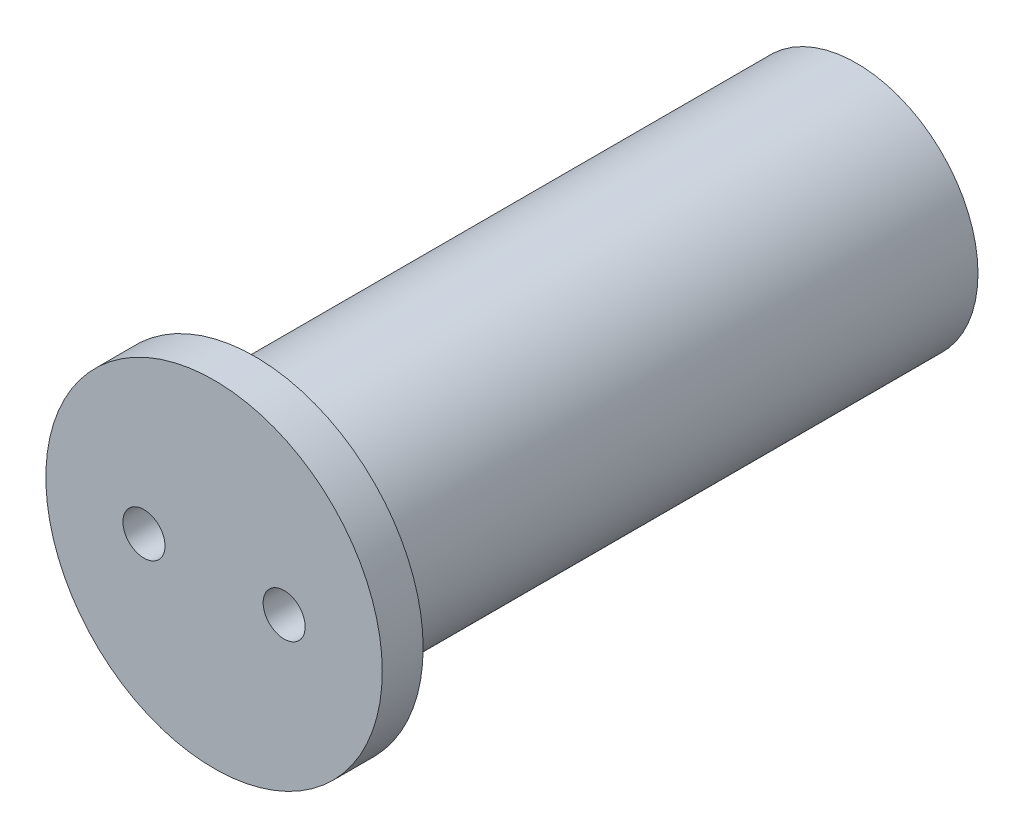
ISO-10303-21;
HEADER;
FILE_DESCRIPTION(('STEP AP214'),'2;1');
FILE_NAME('part.step','',(''),(''),'','','');
FILE_SCHEMA(('AUTOMOTIVE_DESIGN { 1 0 10303 214 1 1 1 1 }'));
ENDSEC;
DATA;
#1=APPLICATION_CONTEXT('core data for automotive mechanical design processes');
#2=APPLICATION_PROTOCOL_DEFINITION('international standard','automotive_design',2000,#1);
#3=PRODUCT_CONTEXT('',#1,'mechanical');
#4=PRODUCT('Part','Part','',(#3));
#5=PRODUCT_RELATED_PRODUCT_CATEGORY('part','',(#4));
#6=PRODUCT_DEFINITION_FORMATION('','',#4);
#7=PRODUCT_DEFINITION_CONTEXT('part definition',#1,'design');
#8=PRODUCT_DEFINITION('design','',#6,#7);
#9=PRODUCT_DEFINITION_SHAPE('','',#8);
#10=(LENGTH_UNIT() NAMED_UNIT(*) SI_UNIT(.MILLI.,.METRE.));
#11=(NAMED_UNIT(*) PLANE_ANGLE_UNIT() SI_UNIT($,.RADIAN.));
#12=(NAMED_UNIT(*) SI_UNIT($,.STERADIAN.) SOLID_ANGLE_UNIT());
#13=UNCERTAINTY_MEASURE_WITH_UNIT(LENGTH_MEASURE(1.E-05),#10,'distance_accuracy_value','');
#14=(GEOMETRIC_REPRESENTATION_CONTEXT(3) GLOBAL_UNCERTAINTY_ASSIGNED_CONTEXT((#13)) GLOBAL_UNIT_ASSIGNED_CONTEXT((#10,
#11,#12)) REPRESENTATION_CONTEXT('',''));
#15=CARTESIAN_POINT('',(0.,0.,0.));
#16=DIRECTION('',(0.,0.,1.));
#17=DIRECTION('',(1.,0.,0.));
#18=AXIS2_PLACEMENT_3D('',#15,#16,#17);
#19=CARTESIAN_POINT('',(0.,0.,27.5));
#20=DIRECTION('',(0.,0.,-1.));
#21=DIRECTION('',(-1.,0.,0.));
#22=AXIS2_PLACEMENT_3D('',#19,#20,#21);
#23=CYLINDRICAL_SURFACE('',#22,5.2);
#24=CARTESIAN_POINT('',(0.,0.,0.));
#25=DIRECTION('',(0.,0.,1.));
#26=DIRECTION('',(1.,0.,0.));
#27=AXIS2_PLACEMENT_3D('',#24,#25,#26);
#28=CIRCLE('',#27,5.2);
#29=CARTESIAN_POINT('',(5.2,0.,0.));
#30=VERTEX_POINT('',#29);
#31=EDGE_CURVE('E37',#30,#30,#28,.T.);
#32=ORIENTED_EDGE('',*,*,#31,.T.);
#33=EDGE_LOOP('',(#32));
#34=FACE_BOUND('',#33,.T.);
#35=CARTESIAN_POINT('',(0.,0.,25.75));
#36=DIRECTION('',(0.,0.,1.));
#37=DIRECTION('',(1.,0.,0.));
#38=AXIS2_PLACEMENT_3D('',#35,#36,#37);
#39=CIRCLE('',#38,5.2);
#40=CARTESIAN_POINT('',(5.2,0.,25.75));
#41=VERTEX_POINT('',#40);
#42=EDGE_CURVE('E10',#41,#41,#39,.T.);
#43=ORIENTED_EDGE('',*,*,#42,.F.);
#44=EDGE_LOOP('',(#43));
#45=FACE_BOUND('',#44,.T.);
#46=ADVANCED_FACE('F31',(#34,#45),#23,.T.);
#47=CARTESIAN_POINT('',(0.,0.,0.));
#48=DIRECTION('',(0.,0.,1.));
#49=DIRECTION('',(1.,0.,0.));
#50=AXIS2_PLACEMENT_3D('',#47,#48,#49);
#51=PLANE('',#50);
#52=CARTESIAN_POINT('',(-3.,0.,0.));
#53=DIRECTION('',(0.,0.,1.));
#54=DIRECTION('',(1.,0.,0.));
#55=AXIS2_PLACEMENT_3D('',#52,#53,#54);
#56=CIRCLE('',#55,0.85);
#57=CARTESIAN_POINT('',(-2.15,0.,0.));
#58=VERTEX_POINT('',#57);
#59=EDGE_CURVE('E58',#58,#58,#56,.T.);
#60=ORIENTED_EDGE('',*,*,#59,.T.);
#61=EDGE_LOOP('',(#60));
#62=FACE_BOUND('',#61,.T.);
#63=CARTESIAN_POINT('',(3.00000000000015,-1.15126107200936E-13,0.));
#64=DIRECTION('',(0.,0.,1.));
#65=DIRECTION('',(1.,0.,0.));
#66=AXIS2_PLACEMENT_3D('',#63,#64,#65);
#67=CIRCLE('',#66,0.85);
#68=CARTESIAN_POINT('',(3.85000000000015,-1.15126107200936E-13,0.));
#69=VERTEX_POINT('',#68);
#70=EDGE_CURVE('E51',#69,#69,#67,.T.);
#71=ORIENTED_EDGE('',*,*,#70,.T.);
#72=EDGE_LOOP('',(#71));
#73=FACE_BOUND('',#72,.T.);
#74=ORIENTED_EDGE('',*,*,#31,.F.);
#75=EDGE_LOOP('',(#74));
#76=FACE_BOUND('',#75,.T.);
#77=ADVANCED_FACE('F89',(#62,#73,#76),#51,.F.);
#78=CARTESIAN_POINT('',(0.,0.,25.75));
#79=DIRECTION('',(0.,0.,1.));
#80=DIRECTION('',(1.,0.,0.));
#81=AXIS2_PLACEMENT_3D('',#78,#79,#80);
#82=CYLINDRICAL_SURFACE('',#81,7.2);
#83=CARTESIAN_POINT('',(0.,0.,25.75));
#84=DIRECTION('',(0.,0.,1.));
#85=DIRECTION('',(1.,0.,0.));
#86=AXIS2_PLACEMENT_3D('',#83,#84,#85);
#87=CIRCLE('',#86,7.2);
#88=CARTESIAN_POINT('',(7.2,0.,25.75));
#89=VERTEX_POINT('',#88);
#90=EDGE_CURVE('E41',#89,#89,#87,.T.);
#91=ORIENTED_EDGE('',*,*,#90,.T.);
#92=EDGE_LOOP('',(#91));
#93=FACE_BOUND('',#92,.T.);
#94=CARTESIAN_POINT('',(0.,0.,27.5));
#95=DIRECTION('',(0.,0.,1.));
#96=DIRECTION('',(1.,0.,0.));
#97=AXIS2_PLACEMENT_3D('',#94,#95,#96);
#98=CIRCLE('',#97,7.2);
#99=CARTESIAN_POINT('',(7.2,0.,27.5));
#100=VERTEX_POINT('',#99);
#101=EDGE_CURVE('E45',#100,#100,#98,.T.);
#102=ORIENTED_EDGE('',*,*,#101,.F.);
#103=EDGE_LOOP('',(#102));
#104=FACE_BOUND('',#103,.T.);
#105=ADVANCED_FACE('F87',(#93,#104),#82,.T.);
#106=CARTESIAN_POINT('',(0.,0.,25.75));
#107=DIRECTION('',(0.,0.,1.));
#108=DIRECTION('',(1.,0.,0.));
#109=AXIS2_PLACEMENT_3D('',#106,#107,#108);
#110=PLANE('',#109);
#111=ORIENTED_EDGE('',*,*,#42,.T.);
#112=EDGE_LOOP('',(#111));
#113=FACE_BOUND('',#112,.T.);
#114=ORIENTED_EDGE('',*,*,#90,.F.);
#115=EDGE_LOOP('',(#114));
#116=FACE_BOUND('',#115,.T.);
#117=ADVANCED_FACE('F81',(#113,#116),#110,.F.);
#118=CARTESIAN_POINT('',(0.,0.,27.5));
#119=DIRECTION('',(0.,0.,1.));
#120=DIRECTION('',(1.,0.,0.));
#121=AXIS2_PLACEMENT_3D('',#118,#119,#120);
#122=PLANE('',#121);
#123=CARTESIAN_POINT('',(-3.,0.,27.5));
#124=DIRECTION('',(0.,0.,1.));
#125=DIRECTION('',(1.,0.,0.));
#126=AXIS2_PLACEMENT_3D('',#123,#124,#125);
#127=CIRCLE('',#126,0.9);
#128=CARTESIAN_POINT('',(-2.1,0.,27.5));
#129=VERTEX_POINT('',#128);
#130=EDGE_CURVE('E66',#129,#129,#127,.T.);
#131=ORIENTED_EDGE('',*,*,#130,.F.);
#132=EDGE_LOOP('',(#131));
#133=FACE_BOUND('',#132,.T.);
#134=CARTESIAN_POINT('',(3.00000000000015,-1.15126107200936E-13,27.5));
#135=DIRECTION('',(0.,0.,1.));
#136=DIRECTION('',(1.,0.,0.));
#137=AXIS2_PLACEMENT_3D('',#134,#135,#136);
#138=CIRCLE('',#137,0.9);
#139=CARTESIAN_POINT('',(3.90000000000015,-1.15126107200936E-13,27.5));
#140=VERTEX_POINT('',#139);
#141=EDGE_CURVE('E67',#140,#140,#138,.T.);
#142=ORIENTED_EDGE('',*,*,#141,.F.);
#143=EDGE_LOOP('',(#142));
#144=FACE_BOUND('',#143,.T.);
#145=ORIENTED_EDGE('',*,*,#101,.T.);
#146=EDGE_LOOP('',(#145));
#147=FACE_BOUND('',#146,.T.);
#148=ADVANCED_FACE('F77',(#133,#144,#147),#122,.T.);
#149=CARTESIAN_POINT('',(3.00000000000015,-1.15126107200936E-13,8.));
#150=DIRECTION('',(0.,0.,-1.));
#151=DIRECTION('',(-1.,0.,0.));
#152=AXIS2_PLACEMENT_3D('',#149,#150,#151);
#153=CYLINDRICAL_SURFACE('',#152,0.85);
#154=CARTESIAN_POINT('',(3.00000000000015,-1.15126107200936E-13,8.));
#155=DIRECTION('',(0.,0.,1.));
#156=DIRECTION('',(1.,0.,0.));
#157=AXIS2_PLACEMENT_3D('',#154,#155,#156);
#158=CIRCLE('',#157,0.85);
#159=CARTESIAN_POINT('',(3.85000000000015,-1.15126107200936E-13,8.));
#160=VERTEX_POINT('',#159);
#161=EDGE_CURVE('E54',#160,#160,#158,.T.);
#162=ORIENTED_EDGE('',*,*,#161,.T.);
#163=EDGE_LOOP('',(#162));
#164=FACE_BOUND('',#163,.T.);
#165=ORIENTED_EDGE('',*,*,#70,.F.);
#166=EDGE_LOOP('',(#165));
#167=FACE_BOUND('',#166,.T.);
#168=ADVANCED_FACE('F80',(#164,#167),#153,.F.);
#169=CARTESIAN_POINT('',(3.00000000000015,-1.15126107200936E-13,8.));
#170=DIRECTION('',(0.,0.,-1.));
#171=DIRECTION('',(1.,0.,0.));
#172=AXIS2_PLACEMENT_3D('',#169,#170,#171);
#173=PLANE('',#172);
#174=ORIENTED_EDGE('',*,*,#161,.F.);
#175=EDGE_LOOP('',(#174));
#176=FACE_BOUND('',#175,.T.);
#177=ADVANCED_FACE('F119',(#176),#173,.T.);
#178=CARTESIAN_POINT('',(-3.,0.,8.));
#179=DIRECTION('',(0.,0.,-1.));
#180=DIRECTION('',(-1.,0.,0.));
#181=AXIS2_PLACEMENT_3D('',#178,#179,#180);
#182=CYLINDRICAL_SURFACE('',#181,0.85);
#183=CARTESIAN_POINT('',(-3.,0.,8.));
#184=DIRECTION('',(0.,0.,1.));
#185=DIRECTION('',(1.,0.,0.));
#186=AXIS2_PLACEMENT_3D('',#183,#184,#185);
#187=CIRCLE('',#186,0.85);
#188=CARTESIAN_POINT('',(-2.15,0.,8.));
#189=VERTEX_POINT('',#188);
#190=EDGE_CURVE('E49',#189,#189,#187,.T.);
#191=ORIENTED_EDGE('',*,*,#190,.T.);
#192=EDGE_LOOP('',(#191));
#193=FACE_BOUND('',#192,.T.);
#194=ORIENTED_EDGE('',*,*,#59,.F.);
#195=EDGE_LOOP('',(#194));
#196=FACE_BOUND('',#195,.T.);
#197=ADVANCED_FACE('F130',(#193,#196),#182,.F.);
#198=CARTESIAN_POINT('',(-3.,0.,8.));
#199=DIRECTION('',(0.,0.,-1.));
#200=DIRECTION('',(1.,0.,0.));
#201=AXIS2_PLACEMENT_3D('',#198,#199,#200);
#202=PLANE('',#201);
#203=ORIENTED_EDGE('',*,*,#190,.F.);
#204=EDGE_LOOP('',(#203));
#205=FACE_BOUND('',#204,.T.);
#206=ADVANCED_FACE('F140',(#205),#202,.T.);
#207=CARTESIAN_POINT('',(-3.,0.,16.9544155877284));
#208=DIRECTION('',(0.,0.,1.));
#209=DIRECTION('',(1.,0.,0.));
#210=AXIS2_PLACEMENT_3D('',#207,#208,#209);
#211=CYLINDRICAL_SURFACE('',#210,0.9);
#212=CARTESIAN_POINT('',(-3.,0.,19.5));
#213=DIRECTION('',(0.,0.,1.));
#214=DIRECTION('',(1.,0.,0.));
#215=AXIS2_PLACEMENT_3D('',#212,#213,#214);
#216=CIRCLE('',#215,0.9);
#217=CARTESIAN_POINT('',(-2.1,0.,19.5));
#218=VERTEX_POINT('',#217);
#219=EDGE_CURVE('E55',#218,#218,#216,.F.);
#220=ORIENTED_EDGE('',*,*,#219,.T.);
#221=EDGE_LOOP('',(#220));
#222=FACE_BOUND('',#221,.T.);
#223=ORIENTED_EDGE('',*,*,#130,.T.);
#224=EDGE_LOOP('',(#223));
#225=FACE_BOUND('',#224,.T.);
#226=ADVANCED_FACE('F75',(#222,#225),#211,.F.);
#227=CARTESIAN_POINT('',(3.00000000000015,-1.15126107200936E-13,16.9544155877284));
#228=DIRECTION('',(0.,0.,1.));
#229=DIRECTION('',(1.,0.,0.));
#230=AXIS2_PLACEMENT_3D('',#227,#228,#229);
#231=CYLINDRICAL_SURFACE('',#230,0.9);
#232=CARTESIAN_POINT('',(3.00000000000015,-1.15126107200936E-13,19.5));
#233=DIRECTION('',(0.,0.,1.));
#234=DIRECTION('',(1.,0.,0.));
#235=AXIS2_PLACEMENT_3D('',#232,#233,#234);
#236=CIRCLE('',#235,0.9);
#237=CARTESIAN_POINT('',(3.90000000000015,-1.15126107200936E-13,19.5));
#238=VERTEX_POINT('',#237);
#239=EDGE_CURVE('E63',#238,#238,#236,.F.);
#240=ORIENTED_EDGE('',*,*,#239,.T.);
#241=EDGE_LOOP('',(#240));
#242=FACE_BOUND('',#241,.T.);
#243=ORIENTED_EDGE('',*,*,#141,.T.);
#244=EDGE_LOOP('',(#243));
#245=FACE_BOUND('',#244,.T.);
#246=ADVANCED_FACE('F166',(#242,#245),#231,.F.);
#247=CARTESIAN_POINT('',(-3.,0.,19.5));
#248=DIRECTION('',(0.,0.,1.));
#249=DIRECTION('',(1.,0.,0.));
#250=AXIS2_PLACEMENT_3D('',#247,#248,#249);
#251=PLANE('',#250);
#252=ORIENTED_EDGE('',*,*,#219,.F.);
#253=EDGE_LOOP('',(#252));
#254=FACE_BOUND('',#253,.T.);
#255=ADVANCED_FACE('F176',(#254),#251,.T.);
#256=CARTESIAN_POINT('',(3.00000000000015,-1.15126107200936E-13,19.5));
#257=DIRECTION('',(0.,0.,1.));
#258=DIRECTION('',(1.,0.,0.));
#259=AXIS2_PLACEMENT_3D('',#256,#257,#258);
#260=PLANE('',#259);
#261=ORIENTED_EDGE('',*,*,#239,.F.);
#262=EDGE_LOOP('',(#261));
#263=FACE_BOUND('',#262,.T.);
#264=ADVANCED_FACE('F186',(#263),#260,.T.);
#265=CLOSED_SHELL('',(#46,#77,#105,#117,#148,#168,#177,#197,#206,#226,#246,#255,#264));
#266=MANIFOLD_SOLID_BREP('B2',#265);
#267=ADVANCED_BREP_SHAPE_REPRESENTATION('',(#18,#266),#14);
#268=SHAPE_DEFINITION_REPRESENTATION(#9,#267);
ENDSEC;
END-ISO-10303-21;
